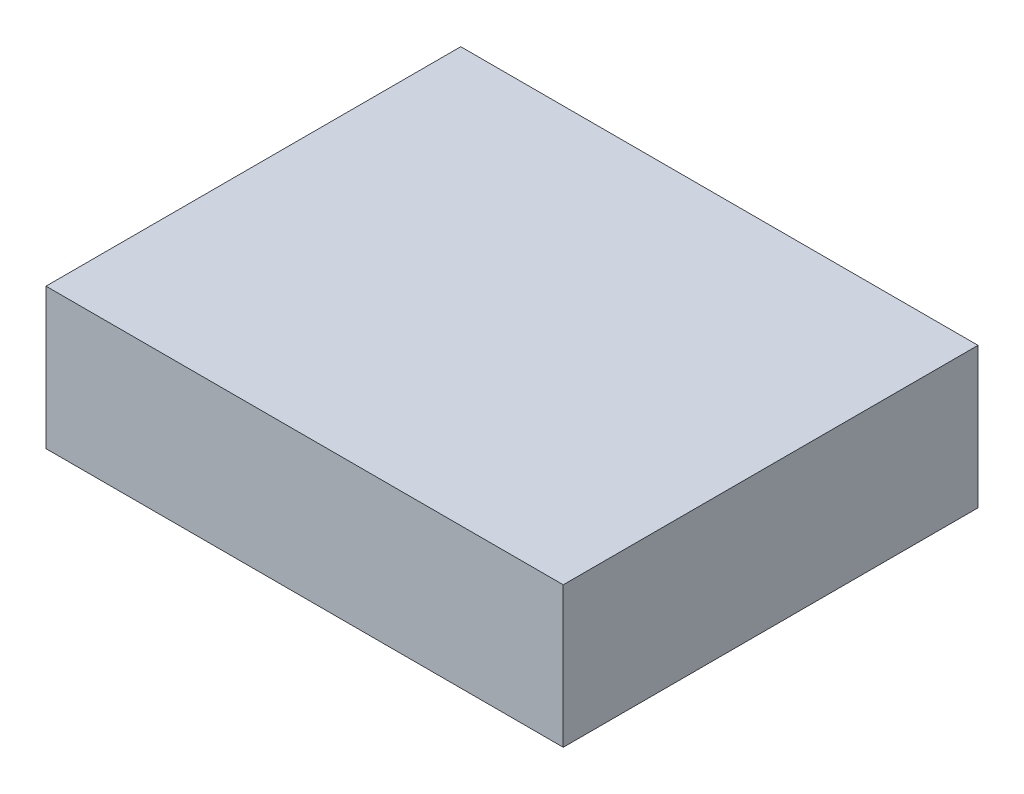
ISO-10303-21;
HEADER;
FILE_DESCRIPTION(('STEP AP214'),'2;1');
FILE_NAME('part.step','',(''),(''),'','','');
FILE_SCHEMA(('AUTOMOTIVE_DESIGN { 1 0 10303 214 1 1 1 1 }'));
ENDSEC;
DATA;
#1=APPLICATION_CONTEXT('core data for automotive mechanical design processes');
#2=APPLICATION_PROTOCOL_DEFINITION('international standard','automotive_design',2000,#1);
#3=PRODUCT_CONTEXT('',#1,'mechanical');
#4=PRODUCT('Part','Part','',(#3));
#5=PRODUCT_RELATED_PRODUCT_CATEGORY('part','',(#4));
#6=PRODUCT_DEFINITION_FORMATION('','',#4);
#7=PRODUCT_DEFINITION_CONTEXT('part definition',#1,'design');
#8=PRODUCT_DEFINITION('design','',#6,#7);
#9=PRODUCT_DEFINITION_SHAPE('','',#8);
#10=(LENGTH_UNIT() NAMED_UNIT(*) SI_UNIT(.MILLI.,.METRE.));
#11=(NAMED_UNIT(*) PLANE_ANGLE_UNIT() SI_UNIT($,.RADIAN.));
#12=(NAMED_UNIT(*) SI_UNIT($,.STERADIAN.) SOLID_ANGLE_UNIT());
#13=UNCERTAINTY_MEASURE_WITH_UNIT(LENGTH_MEASURE(1.E-05),#10,'distance_accuracy_value','');
#14=(GEOMETRIC_REPRESENTATION_CONTEXT(3) GLOBAL_UNCERTAINTY_ASSIGNED_CONTEXT((#13)) GLOBAL_UNIT_ASSIGNED_CONTEXT((#10,
#11,#12)) REPRESENTATION_CONTEXT('',''));
#15=CARTESIAN_POINT('',(0.,0.,0.));
#16=DIRECTION('',(0.,0.,1.));
#17=DIRECTION('',(1.,0.,0.));
#18=AXIS2_PLACEMENT_3D('',#15,#16,#17);
#19=CARTESIAN_POINT('',(37.85,20.6,-30.35));
#20=DIRECTION('',(-1.,0.,0.));
#21=DIRECTION('',(0.,0.,1.));
#22=AXIS2_PLACEMENT_3D('',#19,#20,#21);
#23=PLANE('',#22);
#24=DIRECTION('',(0.,0.,-1.));
#25=VECTOR('',#24,1.);
#26=CARTESIAN_POINT('',(37.85,0.,-30.35));
#27=LINE('',#26,#25);
#28=CARTESIAN_POINT('',(37.85,0.,30.35));
#29=VERTEX_POINT('',#28);
#30=CARTESIAN_POINT('',(37.85,0.,-30.35));
#31=VERTEX_POINT('',#30);
#32=EDGE_CURVE('E96',#29,#31,#27,.T.);
#33=ORIENTED_EDGE('',*,*,#32,.T.);
#34=DIRECTION('',(0.,-1.,0.));
#35=VECTOR('',#34,1.);
#36=CARTESIAN_POINT('',(37.85,20.6,-30.35));
#37=LINE('',#36,#35);
#38=CARTESIAN_POINT('',(37.85,20.6,-30.35));
#39=VERTEX_POINT('',#38);
#40=EDGE_CURVE('E11',#39,#31,#37,.T.);
#41=ORIENTED_EDGE('',*,*,#40,.F.);
#42=DIRECTION('',(0.,0.,-1.));
#43=VECTOR('',#42,1.);
#44=CARTESIAN_POINT('',(37.85,20.6,-30.35));
#45=LINE('',#44,#43);
#46=CARTESIAN_POINT('',(37.85,20.6,30.35));
#47=VERTEX_POINT('',#46);
#48=EDGE_CURVE('E84',#47,#39,#45,.T.);
#49=ORIENTED_EDGE('',*,*,#48,.F.);
#50=DIRECTION('',(0.,-1.,0.));
#51=VECTOR('',#50,1.);
#52=CARTESIAN_POINT('',(37.85,20.6,30.35));
#53=LINE('',#52,#51);
#54=EDGE_CURVE('E92',#47,#29,#53,.T.);
#55=ORIENTED_EDGE('',*,*,#54,.T.);
#56=EDGE_LOOP('',(#33,#41,#49,#55));
#57=FACE_BOUND('',#56,.T.);
#58=ADVANCED_FACE('F33',(#57),#23,.F.);
#59=CARTESIAN_POINT('',(-37.85,20.6,-30.35));
#60=DIRECTION('',(0.,0.,1.));
#61=DIRECTION('',(1.,0.,0.));
#62=AXIS2_PLACEMENT_3D('',#59,#60,#61);
#63=PLANE('',#62);
#64=DIRECTION('',(-1.,0.,0.));
#65=VECTOR('',#64,1.);
#66=CARTESIAN_POINT('',(-37.85,0.,-30.35));
#67=LINE('',#66,#65);
#68=CARTESIAN_POINT('',(-37.85,0.,-30.35));
#69=VERTEX_POINT('',#68);
#70=EDGE_CURVE('E88',#31,#69,#67,.T.);
#71=ORIENTED_EDGE('',*,*,#70,.T.);
#72=DIRECTION('',(0.,-1.,0.));
#73=VECTOR('',#72,1.);
#74=CARTESIAN_POINT('',(-37.85,20.6,-30.35));
#75=LINE('',#74,#73);
#76=CARTESIAN_POINT('',(-37.85,20.6,-30.35));
#77=VERTEX_POINT('',#76);
#78=EDGE_CURVE('E41',#77,#69,#75,.T.);
#79=ORIENTED_EDGE('',*,*,#78,.F.);
#80=DIRECTION('',(-1.,0.,0.));
#81=VECTOR('',#80,1.);
#82=CARTESIAN_POINT('',(-37.85,20.6,-30.35));
#83=LINE('',#82,#81);
#84=EDGE_CURVE('E79',#39,#77,#83,.T.);
#85=ORIENTED_EDGE('',*,*,#84,.F.);
#86=ORIENTED_EDGE('',*,*,#40,.T.);
#87=EDGE_LOOP('',(#71,#79,#85,#86));
#88=FACE_BOUND('',#87,.T.);
#89=ADVANCED_FACE('F87',(#88),#63,.F.);
#90=CARTESIAN_POINT('',(-37.85,20.6,-30.35));
#91=DIRECTION('',(1.,0.,0.));
#92=DIRECTION('',(0.,0.,-1.));
#93=AXIS2_PLACEMENT_3D('',#90,#91,#92);
#94=PLANE('',#93);
#95=DIRECTION('',(0.,0.,1.));
#96=VECTOR('',#95,1.);
#97=CARTESIAN_POINT('',(-37.85,0.,-30.35));
#98=LINE('',#97,#96);
#99=CARTESIAN_POINT('',(-37.85,0.,30.35));
#100=VERTEX_POINT('',#99);
#101=EDGE_CURVE('E66',#69,#100,#98,.T.);
#102=ORIENTED_EDGE('',*,*,#101,.T.);
#103=DIRECTION('',(0.,-1.,0.));
#104=VECTOR('',#103,1.);
#105=CARTESIAN_POINT('',(-37.85,20.6,30.35));
#106=LINE('',#105,#104);
#107=CARTESIAN_POINT('',(-37.85,20.6,30.35));
#108=VERTEX_POINT('',#107);
#109=EDGE_CURVE('E89',#108,#100,#106,.T.);
#110=ORIENTED_EDGE('',*,*,#109,.F.);
#111=DIRECTION('',(0.,0.,1.));
#112=VECTOR('',#111,1.);
#113=CARTESIAN_POINT('',(-37.85,20.6,-30.35));
#114=LINE('',#113,#112);
#115=EDGE_CURVE('E82',#77,#108,#114,.T.);
#116=ORIENTED_EDGE('',*,*,#115,.F.);
#117=ORIENTED_EDGE('',*,*,#78,.T.);
#118=EDGE_LOOP('',(#102,#110,#116,#117));
#119=FACE_BOUND('',#118,.T.);
#120=ADVANCED_FACE('F90',(#119),#94,.F.);
#121=CARTESIAN_POINT('',(-37.85,20.6,30.35));
#122=DIRECTION('',(0.,0.,-1.));
#123=DIRECTION('',(-1.,0.,0.));
#124=AXIS2_PLACEMENT_3D('',#121,#122,#123);
#125=PLANE('',#124);
#126=DIRECTION('',(1.,0.,0.));
#127=VECTOR('',#126,1.);
#128=CARTESIAN_POINT('',(-37.85,0.,30.35));
#129=LINE('',#128,#127);
#130=EDGE_CURVE('E72',#100,#29,#129,.T.);
#131=ORIENTED_EDGE('',*,*,#130,.T.);
#132=ORIENTED_EDGE('',*,*,#54,.F.);
#133=DIRECTION('',(1.,0.,0.));
#134=VECTOR('',#133,1.);
#135=CARTESIAN_POINT('',(-37.85,20.6,30.35));
#136=LINE('',#135,#134);
#137=EDGE_CURVE('E49',#108,#47,#136,.T.);
#138=ORIENTED_EDGE('',*,*,#137,.F.);
#139=ORIENTED_EDGE('',*,*,#109,.T.);
#140=EDGE_LOOP('',(#131,#132,#138,#139));
#141=FACE_BOUND('',#140,.T.);
#142=ADVANCED_FACE('F103',(#141),#125,.F.);
#143=CARTESIAN_POINT('',(0.,20.6,0.));
#144=DIRECTION('',(0.,1.,0.));
#145=DIRECTION('',(0.,0.,1.));
#146=AXIS2_PLACEMENT_3D('',#143,#144,#145);
#147=PLANE('',#146);
#148=ORIENTED_EDGE('',*,*,#48,.T.);
#149=ORIENTED_EDGE('',*,*,#84,.T.);
#150=ORIENTED_EDGE('',*,*,#115,.T.);
#151=ORIENTED_EDGE('',*,*,#137,.T.);
#152=EDGE_LOOP('',(#148,#149,#150,#151));
#153=FACE_BOUND('',#152,.T.);
#154=ADVANCED_FACE('F80',(#153),#147,.T.);
#155=CARTESIAN_POINT('',(0.,0.,0.));
#156=DIRECTION('',(0.,1.,0.));
#157=DIRECTION('',(0.,0.,1.));
#158=AXIS2_PLACEMENT_3D('',#155,#156,#157);
#159=PLANE('',#158);
#160=ORIENTED_EDGE('',*,*,#32,.F.);
#161=ORIENTED_EDGE('',*,*,#130,.F.);
#162=ORIENTED_EDGE('',*,*,#101,.F.);
#163=ORIENTED_EDGE('',*,*,#70,.F.);
#164=EDGE_LOOP('',(#160,#161,#162,#163));
#165=FACE_BOUND('',#164,.T.);
#166=ADVANCED_FACE('F106',(#165),#159,.F.);
#167=CLOSED_SHELL('',(#58,#89,#120,#142,#154,#166));
#168=MANIFOLD_SOLID_BREP('B2',#167);
#169=ADVANCED_BREP_SHAPE_REPRESENTATION('',(#18,#168),#14);
#170=SHAPE_DEFINITION_REPRESENTATION(#9,#169);
ENDSEC;
END-ISO-10303-21;
